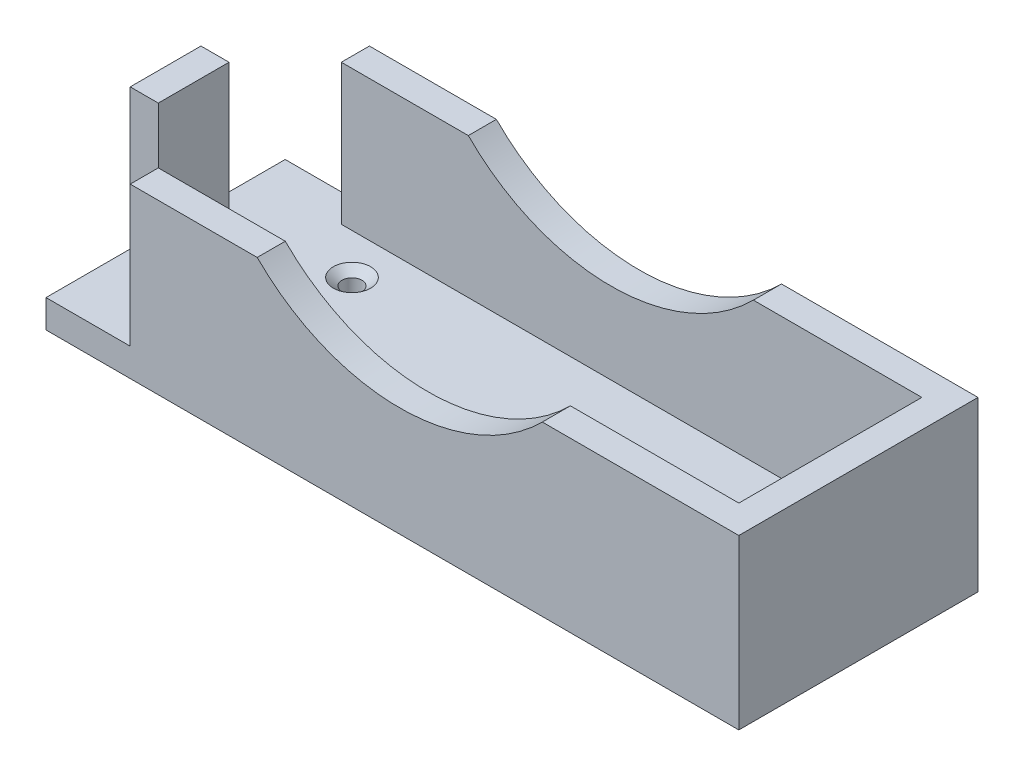
ISO-10303-21;
HEADER;
FILE_DESCRIPTION(('STEP AP214'),'2;1');
FILE_NAME('part.step','',(''),(''),'','','');
FILE_SCHEMA(('AUTOMOTIVE_DESIGN { 1 0 10303 214 1 1 1 1 }'));
ENDSEC;
DATA;
#1=APPLICATION_CONTEXT('core data for automotive mechanical design processes');
#2=APPLICATION_PROTOCOL_DEFINITION('international standard','automotive_design',2000,#1);
#3=PRODUCT_CONTEXT('',#1,'mechanical');
#4=PRODUCT('Part','Part','',(#3));
#5=PRODUCT_RELATED_PRODUCT_CATEGORY('part','',(#4));
#6=PRODUCT_DEFINITION_FORMATION('','',#4);
#7=PRODUCT_DEFINITION_CONTEXT('part definition',#1,'design');
#8=PRODUCT_DEFINITION('design','',#6,#7);
#9=PRODUCT_DEFINITION_SHAPE('','',#8);
#10=(LENGTH_UNIT() NAMED_UNIT(*) SI_UNIT(.MILLI.,.METRE.));
#11=(NAMED_UNIT(*) PLANE_ANGLE_UNIT() SI_UNIT($,.RADIAN.));
#12=(NAMED_UNIT(*) SI_UNIT($,.STERADIAN.) SOLID_ANGLE_UNIT());
#13=UNCERTAINTY_MEASURE_WITH_UNIT(LENGTH_MEASURE(1.E-05),#10,'distance_accuracy_value','');
#14=(GEOMETRIC_REPRESENTATION_CONTEXT(3) GLOBAL_UNCERTAINTY_ASSIGNED_CONTEXT((#13)) GLOBAL_UNIT_ASSIGNED_CONTEXT((#10,
#11,#12)) REPRESENTATION_CONTEXT('',''));
#15=CARTESIAN_POINT('',(0.,0.,0.));
#16=DIRECTION('',(0.,0.,1.));
#17=DIRECTION('',(1.,0.,0.));
#18=AXIS2_PLACEMENT_3D('',#15,#16,#17);
#19=CARTESIAN_POINT('',(0.,38.1,0.));
#20=DIRECTION('',(0.,1.,0.));
#21=DIRECTION('',(0.,0.,1.));
#22=AXIS2_PLACEMENT_3D('',#19,#20,#21);
#23=PLANE('',#22);
#24=DIRECTION('',(0.,0.,1.));
#25=VECTOR('',#24,1.);
#26=CARTESIAN_POINT('',(-28.0299691064171,38.1,-16.4798217821782));
#27=LINE('',#26,#25);
#28=CARTESIAN_POINT('',(-28.0299691064171,38.1,31.2721782178218));
#29=VERTEX_POINT('',#28);
#30=CARTESIAN_POINT('',(-28.0299691064171,38.1,37.6221782178218));
#31=VERTEX_POINT('',#30);
#32=EDGE_CURVE('E222',#29,#31,#27,.T.);
#33=ORIENTED_EDGE('',*,*,#32,.F.);
#34=DIRECTION('',(1.,0.,0.));
#35=VECTOR('',#34,1.);
#36=CARTESIAN_POINT('',(0.,38.1,31.2721782178218));
#37=LINE('',#36,#35);
#38=CARTESIAN_POINT('',(-56.7554506835294,38.1,31.2721782178218));
#39=VERTEX_POINT('',#38);
#40=EDGE_CURVE('E277',#39,#29,#37,.T.);
#41=ORIENTED_EDGE('',*,*,#40,.F.);
#42=DIRECTION('',(0.,0.,1.));
#43=VECTOR('',#42,1.);
#44=CARTESIAN_POINT('',(-56.7554506835295,38.1,0.));
#45=LINE('',#44,#43);
#46=CARTESIAN_POINT('',(-56.7554506835294,38.1,37.6221782178218));
#47=VERTEX_POINT('',#46);
#48=EDGE_CURVE('E280',#39,#47,#45,.T.);
#49=ORIENTED_EDGE('',*,*,#48,.T.);
#50=DIRECTION('',(1.,0.,0.));
#51=VECTOR('',#50,1.);
#52=CARTESIAN_POINT('',(0.,38.1,37.6221782178218));
#53=LINE('',#52,#51);
#54=EDGE_CURVE('E341',#47,#31,#53,.T.);
#55=ORIENTED_EDGE('',*,*,#54,.T.);
#56=EDGE_LOOP('',(#33,#41,#49,#55));
#57=FACE_BOUND('',#56,.T.);
#58=ADVANCED_FACE('F63',(#57),#23,.T.);
#59=CARTESIAN_POINT('',(-28.0299691064171,38.1,-16.4798217821782));
#60=VERTEX_POINT('',#59);
#61=CARTESIAN_POINT('',(-28.0299691064171,38.1,-10.1298217821782));
#62=VERTEX_POINT('',#61);
#63=EDGE_CURVE('E223',#60,#62,#27,.T.);
#64=ORIENTED_EDGE('',*,*,#63,.F.);
#65=DIRECTION('',(1.,0.,0.));
#66=VECTOR('',#65,1.);
#67=CARTESIAN_POINT('',(0.,38.1,-16.4798217821782));
#68=LINE('',#67,#66);
#69=CARTESIAN_POINT('',(-56.7554506835294,38.1,-16.4798217821782));
#70=VERTEX_POINT('',#69);
#71=EDGE_CURVE('E348',#70,#60,#68,.T.);
#72=ORIENTED_EDGE('',*,*,#71,.F.);
#73=DIRECTION('',(0.,0.,1.));
#74=VECTOR('',#73,1.);
#75=CARTESIAN_POINT('',(-56.7554506835294,38.1,0.));
#76=LINE('',#75,#74);
#77=CARTESIAN_POINT('',(-56.7554506835294,38.1,-10.1298217821782));
#78=VERTEX_POINT('',#77);
#79=EDGE_CURVE('E291',#70,#78,#76,.T.);
#80=ORIENTED_EDGE('',*,*,#79,.T.);
#81=DIRECTION('',(1.,0.,0.));
#82=VECTOR('',#81,1.);
#83=CARTESIAN_POINT('',(0.,38.1,-10.1298217821782));
#84=LINE('',#83,#82);
#85=EDGE_CURVE('E294',#78,#62,#84,.T.);
#86=ORIENTED_EDGE('',*,*,#85,.T.);
#87=EDGE_LOOP('',(#64,#72,#80,#86));
#88=FACE_BOUND('',#87,.T.);
#89=ADVANCED_FACE('F399',(#88),#23,.T.);
#90=CARTESIAN_POINT('',(74.5625493164706,38.1,0.));
#91=DIRECTION('',(1.,0.,0.));
#92=DIRECTION('',(0.,0.,-1.));
#93=AXIS2_PLACEMENT_3D('',#90,#91,#92);
#94=PLANE('',#93);
#95=DIRECTION('',(0.,0.,1.));
#96=VECTOR('',#95,1.);
#97=CARTESIAN_POINT('',(74.5625493164706,6.35,0.));
#98=LINE('',#97,#96);
#99=CARTESIAN_POINT('',(74.5625493164706,6.35000000000002,-10.1298217821782));
#100=VERTEX_POINT('',#99);
#101=CARTESIAN_POINT('',(74.5625493164706,6.35,31.2721782178218));
#102=VERTEX_POINT('',#101);
#103=EDGE_CURVE('E324',#100,#102,#98,.T.);
#104=ORIENTED_EDGE('',*,*,#103,.T.);
#105=DIRECTION('',(0.,-1.,0.));
#106=VECTOR('',#105,1.);
#107=CARTESIAN_POINT('',(74.5625493164706,38.1,31.2721782178218));
#108=LINE('',#107,#106);
#109=CARTESIAN_POINT('',(74.5625493164706,38.1,31.2721782178218));
#110=VERTEX_POINT('',#109);
#111=EDGE_CURVE('E283',#110,#102,#108,.T.);
#112=ORIENTED_EDGE('',*,*,#111,.F.);
#113=DIRECTION('',(0.,0.,1.));
#114=VECTOR('',#113,1.);
#115=CARTESIAN_POINT('',(74.5625493164706,38.1,0.));
#116=LINE('',#115,#114);
#117=CARTESIAN_POINT('',(74.5625493164706,38.1,-10.1298217821782));
#118=VERTEX_POINT('',#117);
#119=EDGE_CURVE('E337',#118,#110,#116,.T.);
#120=ORIENTED_EDGE('',*,*,#119,.F.);
#121=DIRECTION('',(0.,-1.,0.));
#122=VECTOR('',#121,1.);
#123=CARTESIAN_POINT('',(74.5625493164706,38.1,-10.1298217821782));
#124=LINE('',#123,#122);
#125=EDGE_CURVE('E297',#118,#100,#124,.T.);
#126=ORIENTED_EDGE('',*,*,#125,.T.);
#127=EDGE_LOOP('',(#104,#112,#120,#126));
#128=FACE_BOUND('',#127,.T.);
#129=ADVANCED_FACE('F65',(#128),#94,.F.);
#130=CARTESIAN_POINT('',(0.,38.1,37.6221782178218));
#131=DIRECTION('',(0.,0.,-1.));
#132=DIRECTION('',(-1.,0.,0.));
#133=AXIS2_PLACEMENT_3D('',#130,#131,#132);
#134=PLANE('',#133);
#135=CARTESIAN_POINT('',(36.4625493164706,38.1,37.6221782178218));
#136=VERTEX_POINT('',#135);
#137=CARTESIAN_POINT('',(80.9125493164706,38.1,37.6221782178218));
#138=VERTEX_POINT('',#137);
#139=EDGE_CURVE('E340',#136,#138,#53,.T.);
#140=ORIENTED_EDGE('',*,*,#139,.F.);
#141=CARTESIAN_POINT('',(4.21629010502675,70.3462592114439,37.6221782178218));
#142=DIRECTION('',(0.,0.,1.));
#143=DIRECTION('',(1.,0.,0.));
#144=AXIS2_PLACEMENT_3D('',#141,#142,#143);
#145=CIRCLE('',#144,45.6030971126223);
#146=EDGE_CURVE('E67',#31,#136,#145,.T.);
#147=ORIENTED_EDGE('',*,*,#146,.F.);
#148=ORIENTED_EDGE('',*,*,#54,.F.);
#149=DIRECTION('',(0.,-1.,0.));
#150=VECTOR('',#149,1.);
#151=CARTESIAN_POINT('',(-56.7554506835294,38.1,37.6221782178218));
#152=LINE('',#151,#150);
#153=CARTESIAN_POINT('',(-56.7554506835294,6.35000000000002,37.6221782178218));
#154=VERTEX_POINT('',#153);
#155=EDGE_CURVE('E285',#47,#154,#152,.T.);
#156=ORIENTED_EDGE('',*,*,#155,.T.);
#157=DIRECTION('',(1.,0.,0.));
#158=VECTOR('',#157,1.);
#159=CARTESIAN_POINT('',(0.,6.35,37.6221782178218));
#160=LINE('',#159,#158);
#161=CARTESIAN_POINT('',(-75.8054506835294,6.35,37.6221782178218));
#162=VERTEX_POINT('',#161);
#163=EDGE_CURVE('E232',#162,#154,#160,.T.);
#164=ORIENTED_EDGE('',*,*,#163,.F.);
#165=DIRECTION('',(0.,-1.,0.));
#166=VECTOR('',#165,1.);
#167=CARTESIAN_POINT('',(-75.8054506835294,6.35,37.6221782178218));
#168=LINE('',#167,#166);
#169=CARTESIAN_POINT('',(-75.8054506835294,0.,37.6221782178218));
#170=VERTEX_POINT('',#169);
#171=EDGE_CURVE('E237',#162,#170,#168,.T.);
#172=ORIENTED_EDGE('',*,*,#171,.T.);
#173=DIRECTION('',(1.,0.,0.));
#174=VECTOR('',#173,1.);
#175=CARTESIAN_POINT('',(0.,0.,37.6221782178218));
#176=LINE('',#175,#174);
#177=CARTESIAN_POINT('',(80.9125493164706,0.,37.6221782178218));
#178=VERTEX_POINT('',#177);
#179=EDGE_CURVE('E336',#170,#178,#176,.T.);
#180=ORIENTED_EDGE('',*,*,#179,.T.);
#181=DIRECTION('',(0.,-1.,0.));
#182=VECTOR('',#181,1.);
#183=CARTESIAN_POINT('',(80.9125493164706,38.1,37.6221782178218));
#184=LINE('',#183,#182);
#185=EDGE_CURVE('E72',#138,#178,#184,.T.);
#186=ORIENTED_EDGE('',*,*,#185,.F.);
#187=EDGE_LOOP('',(#140,#147,#148,#156,#164,#172,#180,#186));
#188=FACE_BOUND('',#187,.T.);
#189=ADVANCED_FACE('F368',(#188),#134,.F.);
#190=CARTESIAN_POINT('',(80.9125493164706,38.1,0.));
#191=DIRECTION('',(1.,0.,0.));
#192=DIRECTION('',(0.,0.,-1.));
#193=AXIS2_PLACEMENT_3D('',#190,#191,#192);
#194=PLANE('',#193);
#195=DIRECTION('',(0.,0.,1.));
#196=VECTOR('',#195,1.);
#197=CARTESIAN_POINT('',(80.9125493164706,0.,0.));
#198=LINE('',#197,#196);
#199=CARTESIAN_POINT('',(80.9125493164706,0.,-16.4798217821782));
#200=VERTEX_POINT('',#199);
#201=EDGE_CURVE('E354',#200,#178,#198,.T.);
#202=ORIENTED_EDGE('',*,*,#201,.F.);
#203=DIRECTION('',(0.,-1.,0.));
#204=VECTOR('',#203,1.);
#205=CARTESIAN_POINT('',(80.9125493164706,38.1,-16.4798217821782));
#206=LINE('',#205,#204);
#207=CARTESIAN_POINT('',(80.9125493164706,38.1,-16.4798217821782));
#208=VERTEX_POINT('',#207);
#209=EDGE_CURVE('E351',#208,#200,#206,.T.);
#210=ORIENTED_EDGE('',*,*,#209,.F.);
#211=DIRECTION('',(0.,0.,1.));
#212=VECTOR('',#211,1.);
#213=CARTESIAN_POINT('',(80.9125493164706,38.1,0.));
#214=LINE('',#213,#212);
#215=EDGE_CURVE('E344',#208,#138,#214,.T.);
#216=ORIENTED_EDGE('',*,*,#215,.T.);
#217=ORIENTED_EDGE('',*,*,#185,.T.);
#218=EDGE_LOOP('',(#202,#210,#216,#217));
#219=FACE_BOUND('',#218,.T.);
#220=ADVANCED_FACE('F362',(#219),#194,.T.);
#221=CARTESIAN_POINT('',(0.,38.1,-16.4798217821782));
#222=DIRECTION('',(0.,0.,-1.));
#223=DIRECTION('',(-1.,0.,0.));
#224=AXIS2_PLACEMENT_3D('',#221,#222,#223);
#225=PLANE('',#224);
#226=CARTESIAN_POINT('',(4.21629010502675,70.3462592114439,-16.4798217821782));
#227=DIRECTION('',(0.,0.,1.));
#228=DIRECTION('',(-1.,0.,0.));
#229=AXIS2_PLACEMENT_3D('',#226,#227,#228);
#230=CIRCLE('',#229,45.6030971126223);
#231=CARTESIAN_POINT('',(36.4625493164706,38.1,-16.4798217821782));
#232=VERTEX_POINT('',#231);
#233=EDGE_CURVE('E200',#60,#232,#230,.T.);
#234=ORIENTED_EDGE('',*,*,#233,.T.);
#235=EDGE_CURVE('E347',#232,#208,#68,.T.);
#236=ORIENTED_EDGE('',*,*,#235,.T.);
#237=ORIENTED_EDGE('',*,*,#209,.T.);
#238=DIRECTION('',(1.,0.,0.));
#239=VECTOR('',#238,1.);
#240=CARTESIAN_POINT('',(0.,0.,-16.4798217821782));
#241=LINE('',#240,#239);
#242=CARTESIAN_POINT('',(-75.8054506835294,0.,-16.4798217821782));
#243=VERTEX_POINT('',#242);
#244=EDGE_CURVE('E198',#243,#200,#241,.T.);
#245=ORIENTED_EDGE('',*,*,#244,.F.);
#246=DIRECTION('',(0.,-1.,0.));
#247=VECTOR('',#246,1.);
#248=CARTESIAN_POINT('',(-75.8054506835294,6.35,-16.4798217821782));
#249=LINE('',#248,#247);
#250=CARTESIAN_POINT('',(-75.8054506835294,6.35,-16.4798217821782));
#251=VERTEX_POINT('',#250);
#252=EDGE_CURVE('E191',#251,#243,#249,.T.);
#253=ORIENTED_EDGE('',*,*,#252,.F.);
#254=DIRECTION('',(1.,0.,0.));
#255=VECTOR('',#254,1.);
#256=CARTESIAN_POINT('',(0.,6.35,-16.4798217821782));
#257=LINE('',#256,#255);
#258=CARTESIAN_POINT('',(-56.7554506835294,6.35000000000002,-16.4798217821782));
#259=VERTEX_POINT('',#258);
#260=EDGE_CURVE('E196',#251,#259,#257,.T.);
#261=ORIENTED_EDGE('',*,*,#260,.T.);
#262=DIRECTION('',(0.,-1.,0.));
#263=VECTOR('',#262,1.);
#264=CARTESIAN_POINT('',(-56.7554506835294,38.1,-16.4798217821782));
#265=LINE('',#264,#263);
#266=EDGE_CURVE('E87',#70,#259,#265,.T.);
#267=ORIENTED_EDGE('',*,*,#266,.F.);
#268=ORIENTED_EDGE('',*,*,#71,.T.);
#269=EDGE_LOOP('',(#234,#236,#237,#245,#253,#261,#267,#268));
#270=FACE_BOUND('',#269,.T.);
#271=ADVANCED_FACE('F194',(#270),#225,.T.);
#272=DIRECTION('',(0.,0.,1.));
#273=VECTOR('',#272,1.);
#274=CARTESIAN_POINT('',(36.4625493164706,38.1,-16.4798217821782));
#275=LINE('',#274,#273);
#276=CARTESIAN_POINT('',(36.4625493164706,38.1,31.2721782178218));
#277=VERTEX_POINT('',#276);
#278=EDGE_CURVE('E218',#277,#136,#275,.T.);
#279=ORIENTED_EDGE('',*,*,#278,.T.);
#280=ORIENTED_EDGE('',*,*,#139,.T.);
#281=ORIENTED_EDGE('',*,*,#215,.F.);
#282=ORIENTED_EDGE('',*,*,#235,.F.);
#283=CARTESIAN_POINT('',(36.4625493164706,38.1,-10.1298217821782));
#284=VERTEX_POINT('',#283);
#285=EDGE_CURVE('E219',#232,#284,#275,.T.);
#286=ORIENTED_EDGE('',*,*,#285,.T.);
#287=EDGE_CURVE('E293',#284,#118,#84,.T.);
#288=ORIENTED_EDGE('',*,*,#287,.T.);
#289=ORIENTED_EDGE('',*,*,#119,.T.);
#290=EDGE_CURVE('E276',#277,#110,#37,.T.);
#291=ORIENTED_EDGE('',*,*,#290,.F.);
#292=EDGE_LOOP('',(#279,#280,#281,#282,#286,#288,#289,#291));
#293=FACE_BOUND('',#292,.T.);
#294=ADVANCED_FACE('F402',(#293),#23,.T.);
#295=CARTESIAN_POINT('',(0.,0.,0.));
#296=DIRECTION('',(0.,1.,0.));
#297=DIRECTION('',(0.,0.,1.));
#298=AXIS2_PLACEMENT_3D('',#295,#296,#297);
#299=PLANE('',#298);
#300=CARTESIAN_POINT('',(-45.1349506835294,0.,21.9376782178218));
#301=DIRECTION('',(0.,1.,0.));
#302=DIRECTION('',(0.,0.,1.));
#303=AXIS2_PLACEMENT_3D('',#300,#301,#302);
#304=CIRCLE('',#303,2.2479);
#305=CARTESIAN_POINT('',(-45.1349506835294,0.,24.1855782178218));
#306=VERTEX_POINT('',#305);
#307=EDGE_CURVE('E246',#306,#306,#304,.T.);
#308=ORIENTED_EDGE('',*,*,#307,.T.);
#309=EDGE_LOOP('',(#308));
#310=FACE_BOUND('',#309,.T.);
#311=CARTESIAN_POINT('',(-45.1349506835295,0.,-0.922321782178217));
#312=DIRECTION('',(0.,1.,0.));
#313=DIRECTION('',(0.,0.,1.));
#314=AXIS2_PLACEMENT_3D('',#311,#312,#313);
#315=CIRCLE('',#314,2.2479);
#316=CARTESIAN_POINT('',(-45.1349506835295,0.,1.32557821782178));
#317=VERTEX_POINT('',#316);
#318=EDGE_CURVE('E255',#317,#317,#315,.T.);
#319=ORIENTED_EDGE('',*,*,#318,.T.);
#320=EDGE_LOOP('',(#319));
#321=FACE_BOUND('',#320,.T.);
#322=CARTESIAN_POINT('',(50.1150493164705,0.,-0.858821782178217));
#323=DIRECTION('',(0.,1.,0.));
#324=DIRECTION('',(0.,0.,1.));
#325=AXIS2_PLACEMENT_3D('',#322,#323,#324);
#326=CIRCLE('',#325,2.2479);
#327=CARTESIAN_POINT('',(50.1150493164705,0.,1.38907821782178));
#328=VERTEX_POINT('',#327);
#329=EDGE_CURVE('E264',#328,#328,#326,.T.);
#330=ORIENTED_EDGE('',*,*,#329,.T.);
#331=EDGE_LOOP('',(#330));
#332=FACE_BOUND('',#331,.T.);
#333=CARTESIAN_POINT('',(50.1150493164706,0.,22.0011782178218));
#334=DIRECTION('',(0.,1.,0.));
#335=DIRECTION('',(0.,0.,1.));
#336=AXIS2_PLACEMENT_3D('',#333,#334,#335);
#337=CIRCLE('',#336,2.2479);
#338=CARTESIAN_POINT('',(50.1150493164706,0.,24.2490782178218));
#339=VERTEX_POINT('',#338);
#340=EDGE_CURVE('E273',#339,#339,#337,.T.);
#341=ORIENTED_EDGE('',*,*,#340,.T.);
#342=EDGE_LOOP('',(#341));
#343=FACE_BOUND('',#342,.T.);
#344=ORIENTED_EDGE('',*,*,#179,.F.);
#345=DIRECTION('',(0.,0.,1.));
#346=VECTOR('',#345,1.);
#347=CARTESIAN_POINT('',(-75.8054506835294,0.,0.));
#348=LINE('',#347,#346);
#349=EDGE_CURVE('E304',#243,#170,#348,.T.);
#350=ORIENTED_EDGE('',*,*,#349,.F.);
#351=ORIENTED_EDGE('',*,*,#244,.T.);
#352=ORIENTED_EDGE('',*,*,#201,.T.);
#353=EDGE_LOOP('',(#344,#350,#351,#352));
#354=FACE_BOUND('',#353,.T.);
#355=ADVANCED_FACE('F372',(#310,#321,#332,#343,#354),#299,.F.);
#356=CARTESIAN_POINT('',(0.,6.35,0.));
#357=DIRECTION('',(0.,1.,0.));
#358=DIRECTION('',(0.,0.,1.));
#359=AXIS2_PLACEMENT_3D('',#356,#357,#358);
#360=PLANE('',#359);
#361=DIRECTION('',(1.,0.,0.));
#362=VECTOR('',#361,1.);
#363=CARTESIAN_POINT('',(0.,6.35,2.57017821782178));
#364=LINE('',#363,#362);
#365=CARTESIAN_POINT('',(-75.8054506835294,6.35000000000002,2.57017821782178));
#366=VERTEX_POINT('',#365);
#367=CARTESIAN_POINT('',(-69.4554506835294,6.35000000000003,2.57017821782178));
#368=VERTEX_POINT('',#367);
#369=EDGE_CURVE('E79',#366,#368,#364,.T.);
#370=ORIENTED_EDGE('',*,*,#369,.T.);
#371=DIRECTION('',(0.,0.,1.));
#372=VECTOR('',#371,1.);
#373=CARTESIAN_POINT('',(-69.4554506835294,6.35,0.));
#374=LINE('',#373,#372);
#375=CARTESIAN_POINT('',(-69.4554506835294,6.35000000000003,18.5721782178218));
#376=VERTEX_POINT('',#375);
#377=EDGE_CURVE('E330',#368,#376,#374,.T.);
#378=ORIENTED_EDGE('',*,*,#377,.T.);
#379=DIRECTION('',(1.,0.,0.));
#380=VECTOR('',#379,1.);
#381=CARTESIAN_POINT('',(0.,6.35,18.5721782178218));
#382=LINE('',#381,#380);
#383=CARTESIAN_POINT('',(-75.8054506835294,6.35000000000002,18.5721782178218));
#384=VERTEX_POINT('',#383);
#385=EDGE_CURVE('E228',#384,#376,#382,.T.);
#386=ORIENTED_EDGE('',*,*,#385,.F.);
#387=DIRECTION('',(0.,0.,1.));
#388=VECTOR('',#387,1.);
#389=CARTESIAN_POINT('',(-75.8054506835294,6.35,0.));
#390=LINE('',#389,#388);
#391=EDGE_CURVE('E230',#384,#162,#390,.T.);
#392=ORIENTED_EDGE('',*,*,#391,.T.);
#393=ORIENTED_EDGE('',*,*,#163,.T.);
#394=DIRECTION('',(0.,0.,1.));
#395=VECTOR('',#394,1.);
#396=CARTESIAN_POINT('',(-56.7554506835295,6.35,0.));
#397=LINE('',#396,#395);
#398=CARTESIAN_POINT('',(-56.7554506835294,6.35000000000002,31.2721782178218));
#399=VERTEX_POINT('',#398);
#400=EDGE_CURVE('E235',#399,#154,#397,.T.);
#401=ORIENTED_EDGE('',*,*,#400,.F.);
#402=DIRECTION('',(1.,0.,0.));
#403=VECTOR('',#402,1.);
#404=CARTESIAN_POINT('',(0.,6.35,31.2721782178218));
#405=LINE('',#404,#403);
#406=EDGE_CURVE('E333',#399,#102,#405,.T.);
#407=ORIENTED_EDGE('',*,*,#406,.T.);
#408=ORIENTED_EDGE('',*,*,#103,.F.);
#409=DIRECTION('',(1.,0.,0.));
#410=VECTOR('',#409,1.);
#411=CARTESIAN_POINT('',(0.,6.35,-10.1298217821782));
#412=LINE('',#411,#410);
#413=CARTESIAN_POINT('',(-56.7554506835294,6.35,-10.1298217821782));
#414=VERTEX_POINT('',#413);
#415=EDGE_CURVE('E327',#414,#100,#412,.T.);
#416=ORIENTED_EDGE('',*,*,#415,.F.);
#417=DIRECTION('',(0.,0.,1.));
#418=VECTOR('',#417,1.);
#419=CARTESIAN_POINT('',(-56.7554506835294,6.35,0.));
#420=LINE('',#419,#418);
#421=EDGE_CURVE('E212',#259,#414,#420,.T.);
#422=ORIENTED_EDGE('',*,*,#421,.F.);
#423=ORIENTED_EDGE('',*,*,#260,.F.);
#424=DIRECTION('',(0.,0.,1.));
#425=VECTOR('',#424,1.);
#426=CARTESIAN_POINT('',(-75.8054506835294,6.35,0.));
#427=LINE('',#426,#425);
#428=EDGE_CURVE('E203',#251,#366,#427,.T.);
#429=ORIENTED_EDGE('',*,*,#428,.T.);
#430=EDGE_LOOP('',(#370,#378,#386,#392,#393,#401,#407,#408,#416,#422,#423,#429));
#431=FACE_BOUND('',#430,.T.);
#432=CARTESIAN_POINT('',(-45.1349506835294,6.35,21.9376782178218));
#433=DIRECTION('',(0.,1.,0.));
#434=DIRECTION('',(0.,0.,1.));
#435=AXIS2_PLACEMENT_3D('',#432,#433,#434);
#436=CIRCLE('',#435,4.2164);
#437=CARTESIAN_POINT('',(-45.1349506835294,6.35,26.1540782178218));
#438=VERTEX_POINT('',#437);
#439=EDGE_CURVE('E240',#438,#438,#436,.T.);
#440=ORIENTED_EDGE('',*,*,#439,.F.);
#441=EDGE_LOOP('',(#440));
#442=FACE_BOUND('',#441,.T.);
#443=CARTESIAN_POINT('',(-45.1349506835295,6.35,-0.922321782178217));
#444=DIRECTION('',(0.,1.,0.));
#445=DIRECTION('',(0.,0.,1.));
#446=AXIS2_PLACEMENT_3D('',#443,#444,#445);
#447=CIRCLE('',#446,4.2164);
#448=CARTESIAN_POINT('',(-45.1349506835295,6.35,3.29407821782179));
#449=VERTEX_POINT('',#448);
#450=EDGE_CURVE('E249',#449,#449,#447,.T.);
#451=ORIENTED_EDGE('',*,*,#450,.F.);
#452=EDGE_LOOP('',(#451));
#453=FACE_BOUND('',#452,.T.);
#454=CARTESIAN_POINT('',(50.1150493164705,6.35,-0.858821782178217));
#455=DIRECTION('',(0.,1.,0.));
#456=DIRECTION('',(0.,0.,1.));
#457=AXIS2_PLACEMENT_3D('',#454,#455,#456);
#458=CIRCLE('',#457,4.2164);
#459=CARTESIAN_POINT('',(50.1150493164705,6.35,3.35757821782178));
#460=VERTEX_POINT('',#459);
#461=EDGE_CURVE('E258',#460,#460,#458,.T.);
#462=ORIENTED_EDGE('',*,*,#461,.F.);
#463=EDGE_LOOP('',(#462));
#464=FACE_BOUND('',#463,.T.);
#465=CARTESIAN_POINT('',(50.1150493164706,6.35,22.0011782178218));
#466=DIRECTION('',(0.,1.,0.));
#467=DIRECTION('',(0.,0.,1.));
#468=AXIS2_PLACEMENT_3D('',#465,#466,#467);
#469=CIRCLE('',#468,4.2164);
#470=CARTESIAN_POINT('',(50.1150493164706,6.35,26.2175782178218));
#471=VERTEX_POINT('',#470);
#472=EDGE_CURVE('E267',#471,#471,#469,.T.);
#473=ORIENTED_EDGE('',*,*,#472,.F.);
#474=EDGE_LOOP('',(#473));
#475=FACE_BOUND('',#474,.T.);
#476=ADVANCED_FACE('F209',(#431,#442,#453,#464,#475),#360,.T.);
#477=CARTESIAN_POINT('',(-69.4554506835294,38.1,0.));
#478=DIRECTION('',(1.,0.,0.));
#479=DIRECTION('',(0.,0.,-1.));
#480=AXIS2_PLACEMENT_3D('',#477,#478,#479);
#481=PLANE('',#480);
#482=ORIENTED_EDGE('',*,*,#377,.F.);
#483=DIRECTION('',(0.,-1.,0.));
#484=VECTOR('',#483,1.);
#485=CARTESIAN_POINT('',(-69.4554506835294,38.1,2.57017821782178));
#486=LINE('',#485,#484);
#487=CARTESIAN_POINT('',(-69.4554506835294,38.1,2.57017821782178));
#488=VERTEX_POINT('',#487);
#489=EDGE_CURVE('E315',#488,#368,#486,.T.);
#490=ORIENTED_EDGE('',*,*,#489,.F.);
#491=DIRECTION('',(0.,0.,1.));
#492=VECTOR('',#491,1.);
#493=CARTESIAN_POINT('',(-69.4554506835294,38.1,0.));
#494=LINE('',#493,#492);
#495=CARTESIAN_POINT('',(-69.4554506835294,38.1,18.5721782178218));
#496=VERTEX_POINT('',#495);
#497=EDGE_CURVE('E312',#488,#496,#494,.T.);
#498=ORIENTED_EDGE('',*,*,#497,.T.);
#499=DIRECTION('',(0.,-1.,0.));
#500=VECTOR('',#499,1.);
#501=CARTESIAN_POINT('',(-69.4554506835294,38.1,18.5721782178218));
#502=LINE('',#501,#500);
#503=EDGE_CURVE('E318',#496,#376,#502,.T.);
#504=ORIENTED_EDGE('',*,*,#503,.T.);
#505=EDGE_LOOP('',(#482,#490,#498,#504));
#506=FACE_BOUND('',#505,.T.);
#507=ADVANCED_FACE('F383',(#506),#481,.T.);
#508=CARTESIAN_POINT('',(0.,38.1,2.57017821782178));
#509=DIRECTION('',(0.,0.,-1.));
#510=DIRECTION('',(-1.,0.,0.));
#511=AXIS2_PLACEMENT_3D('',#508,#509,#510);
#512=PLANE('',#511);
#513=ORIENTED_EDGE('',*,*,#369,.F.);
#514=DIRECTION('',(0.,-1.,0.));
#515=VECTOR('',#514,1.);
#516=CARTESIAN_POINT('',(-75.8054506835294,38.1,2.57017821782178));
#517=LINE('',#516,#515);
#518=CARTESIAN_POINT('',(-75.8054506835294,38.1,2.57017821782178));
#519=VERTEX_POINT('',#518);
#520=EDGE_CURVE('E206',#519,#366,#517,.T.);
#521=ORIENTED_EDGE('',*,*,#520,.F.);
#522=DIRECTION('',(1.,0.,0.));
#523=VECTOR('',#522,1.);
#524=CARTESIAN_POINT('',(0.,38.1,2.57017821782178));
#525=LINE('',#524,#523);
#526=EDGE_CURVE('E305',#519,#488,#525,.T.);
#527=ORIENTED_EDGE('',*,*,#526,.T.);
#528=ORIENTED_EDGE('',*,*,#489,.T.);
#529=EDGE_LOOP('',(#513,#521,#527,#528));
#530=FACE_BOUND('',#529,.T.);
#531=ADVANCED_FACE('F388',(#530),#512,.T.);
#532=CARTESIAN_POINT('',(-75.8054506835294,38.1,0.));
#533=DIRECTION('',(1.,0.,0.));
#534=DIRECTION('',(0.,0.,-1.));
#535=AXIS2_PLACEMENT_3D('',#532,#533,#534);
#536=PLANE('',#535);
#537=ORIENTED_EDGE('',*,*,#349,.T.);
#538=ORIENTED_EDGE('',*,*,#171,.F.);
#539=ORIENTED_EDGE('',*,*,#391,.F.);
#540=DIRECTION('',(0.,-1.,0.));
#541=VECTOR('',#540,1.);
#542=CARTESIAN_POINT('',(-75.8054506835294,38.1,18.5721782178218));
#543=LINE('',#542,#541);
#544=CARTESIAN_POINT('',(-75.8054506835294,38.1,18.5721782178218));
#545=VERTEX_POINT('',#544);
#546=EDGE_CURVE('E321',#545,#384,#543,.T.);
#547=ORIENTED_EDGE('',*,*,#546,.F.);
#548=DIRECTION('',(0.,0.,1.));
#549=VECTOR('',#548,1.);
#550=CARTESIAN_POINT('',(-75.8054506835294,38.1,0.));
#551=LINE('',#550,#549);
#552=EDGE_CURVE('E308',#519,#545,#551,.T.);
#553=ORIENTED_EDGE('',*,*,#552,.F.);
#554=ORIENTED_EDGE('',*,*,#520,.T.);
#555=ORIENTED_EDGE('',*,*,#428,.F.);
#556=ORIENTED_EDGE('',*,*,#252,.T.);
#557=EDGE_LOOP('',(#537,#538,#539,#547,#553,#554,#555,#556));
#558=FACE_BOUND('',#557,.T.);
#559=ADVANCED_FACE('F204',(#558),#536,.F.);
#560=CARTESIAN_POINT('',(0.,38.1,18.5721782178218));
#561=DIRECTION('',(0.,0.,-1.));
#562=DIRECTION('',(-1.,0.,0.));
#563=AXIS2_PLACEMENT_3D('',#560,#561,#562);
#564=PLANE('',#563);
#565=ORIENTED_EDGE('',*,*,#546,.T.);
#566=ORIENTED_EDGE('',*,*,#385,.T.);
#567=ORIENTED_EDGE('',*,*,#503,.F.);
#568=DIRECTION('',(1.,0.,0.));
#569=VECTOR('',#568,1.);
#570=CARTESIAN_POINT('',(0.,38.1,18.5721782178218));
#571=LINE('',#570,#569);
#572=EDGE_CURVE('E310',#545,#496,#571,.T.);
#573=ORIENTED_EDGE('',*,*,#572,.F.);
#574=EDGE_LOOP('',(#565,#566,#567,#573));
#575=FACE_BOUND('',#574,.T.);
#576=ADVANCED_FACE('F380',(#575),#564,.F.);
#577=CARTESIAN_POINT('',(0.,38.1,0.));
#578=DIRECTION('',(0.,1.,0.));
#579=DIRECTION('',(0.,0.,1.));
#580=AXIS2_PLACEMENT_3D('',#577,#578,#579);
#581=PLANE('',#580);
#582=ORIENTED_EDGE('',*,*,#526,.F.);
#583=ORIENTED_EDGE('',*,*,#552,.T.);
#584=ORIENTED_EDGE('',*,*,#572,.T.);
#585=ORIENTED_EDGE('',*,*,#497,.F.);
#586=EDGE_LOOP('',(#582,#583,#584,#585));
#587=FACE_BOUND('',#586,.T.);
#588=ADVANCED_FACE('F387',(#587),#581,.T.);
#589=CARTESIAN_POINT('',(-56.7554506835294,38.1,0.));
#590=DIRECTION('',(1.,0.,0.));
#591=DIRECTION('',(0.,0.,-1.));
#592=AXIS2_PLACEMENT_3D('',#589,#590,#591);
#593=PLANE('',#592);
#594=ORIENTED_EDGE('',*,*,#266,.T.);
#595=ORIENTED_EDGE('',*,*,#421,.T.);
#596=DIRECTION('',(0.,-1.,0.));
#597=VECTOR('',#596,1.);
#598=CARTESIAN_POINT('',(-56.7554506835294,38.1,-10.1298217821782));
#599=LINE('',#598,#597);
#600=EDGE_CURVE('E300',#78,#414,#599,.T.);
#601=ORIENTED_EDGE('',*,*,#600,.F.);
#602=ORIENTED_EDGE('',*,*,#79,.F.);
#603=EDGE_LOOP('',(#594,#595,#601,#602));
#604=FACE_BOUND('',#603,.T.);
#605=ADVANCED_FACE('F437',(#604),#593,.F.);
#606=CARTESIAN_POINT('',(0.,38.1,-10.1298217821782));
#607=DIRECTION('',(0.,0.,-1.));
#608=DIRECTION('',(-1.,0.,0.));
#609=AXIS2_PLACEMENT_3D('',#606,#607,#608);
#610=PLANE('',#609);
#611=ORIENTED_EDGE('',*,*,#287,.F.);
#612=CARTESIAN_POINT('',(4.21629010502675,70.3462592114439,-10.1298217821782));
#613=DIRECTION('',(0.,0.,-1.));
#614=DIRECTION('',(-1.,0.,0.));
#615=AXIS2_PLACEMENT_3D('',#612,#613,#614);
#616=CIRCLE('',#615,45.6030971126223);
#617=EDGE_CURVE('E225',#284,#62,#616,.T.);
#618=ORIENTED_EDGE('',*,*,#617,.T.);
#619=ORIENTED_EDGE('',*,*,#85,.F.);
#620=ORIENTED_EDGE('',*,*,#600,.T.);
#621=ORIENTED_EDGE('',*,*,#415,.T.);
#622=ORIENTED_EDGE('',*,*,#125,.F.);
#623=EDGE_LOOP('',(#611,#618,#619,#620,#621,#622));
#624=FACE_BOUND('',#623,.T.);
#625=ADVANCED_FACE('F434',(#624),#610,.F.);
#626=CARTESIAN_POINT('',(0.,38.1,31.2721782178218));
#627=DIRECTION('',(0.,0.,-1.));
#628=DIRECTION('',(-1.,0.,0.));
#629=AXIS2_PLACEMENT_3D('',#626,#627,#628);
#630=PLANE('',#629);
#631=CARTESIAN_POINT('',(4.21629010502675,70.3462592114439,31.2721782178218));
#632=DIRECTION('',(0.,0.,-1.));
#633=DIRECTION('',(-1.,0.,0.));
#634=AXIS2_PLACEMENT_3D('',#631,#632,#633);
#635=CIRCLE('',#634,45.6030971126223);
#636=EDGE_CURVE('E12',#277,#29,#635,.T.);
#637=ORIENTED_EDGE('',*,*,#636,.F.);
#638=ORIENTED_EDGE('',*,*,#290,.T.);
#639=ORIENTED_EDGE('',*,*,#111,.T.);
#640=ORIENTED_EDGE('',*,*,#406,.F.);
#641=DIRECTION('',(0.,-1.,0.));
#642=VECTOR('',#641,1.);
#643=CARTESIAN_POINT('',(-56.7554506835294,38.1,31.2721782178218));
#644=LINE('',#643,#642);
#645=EDGE_CURVE('E288',#39,#399,#644,.T.);
#646=ORIENTED_EDGE('',*,*,#645,.F.);
#647=ORIENTED_EDGE('',*,*,#40,.T.);
#648=EDGE_LOOP('',(#637,#638,#639,#640,#646,#647));
#649=FACE_BOUND('',#648,.T.);
#650=ADVANCED_FACE('F427',(#649),#630,.T.);
#651=CARTESIAN_POINT('',(-56.7554506835295,38.1,0.));
#652=DIRECTION('',(1.,0.,0.));
#653=DIRECTION('',(0.,0.,-1.));
#654=AXIS2_PLACEMENT_3D('',#651,#652,#653);
#655=PLANE('',#654);
#656=ORIENTED_EDGE('',*,*,#645,.T.);
#657=ORIENTED_EDGE('',*,*,#400,.T.);
#658=ORIENTED_EDGE('',*,*,#155,.F.);
#659=ORIENTED_EDGE('',*,*,#48,.F.);
#660=EDGE_LOOP('',(#656,#657,#658,#659));
#661=FACE_BOUND('',#660,.T.);
#662=ADVANCED_FACE('F425',(#661),#655,.F.);
#663=CARTESIAN_POINT('',(50.1150493164706,6.35,22.0011782178218));
#664=DIRECTION('',(0.,1.,0.));
#665=DIRECTION('',(0.,0.,1.));
#666=AXIS2_PLACEMENT_3D('',#663,#664,#665);
#667=CYLINDRICAL_SURFACE('',#666,2.24789999999999);
#668=ORIENTED_EDGE('',*,*,#340,.F.);
#669=EDGE_LOOP('',(#668));
#670=FACE_BOUND('',#669,.T.);
#671=CARTESIAN_POINT('',(50.1150493164706,4.69823237602753,22.0011782178218));
#672=DIRECTION('',(0.,1.,0.));
#673=DIRECTION('',(0.,0.,1.));
#674=AXIS2_PLACEMENT_3D('',#671,#672,#673);
#675=CIRCLE('',#674,2.24789999999998);
#676=CARTESIAN_POINT('',(50.1150493164706,4.69823237602753,24.2490782178218));
#677=VERTEX_POINT('',#676);
#678=EDGE_CURVE('E270',#677,#677,#675,.T.);
#679=ORIENTED_EDGE('',*,*,#678,.T.);
#680=EDGE_LOOP('',(#679));
#681=FACE_BOUND('',#680,.T.);
#682=ADVANCED_FACE('F476',(#670,#681),#667,.F.);
#683=CARTESIAN_POINT('',(50.1150493164706,6.35,22.0011782178218));
#684=DIRECTION('',(0.,1.,0.));
#685=DIRECTION('',(0.,0.,1.));
#686=AXIS2_PLACEMENT_3D('',#683,#684,#685);
#687=CONICAL_SURFACE('',#686,4.2164,0.872664625997171);
#688=ORIENTED_EDGE('',*,*,#678,.F.);
#689=EDGE_LOOP('',(#688));
#690=FACE_BOUND('',#689,.T.);
#691=ORIENTED_EDGE('',*,*,#472,.T.);
#692=EDGE_LOOP('',(#691));
#693=FACE_BOUND('',#692,.T.);
#694=ADVANCED_FACE('F472',(#690,#693),#687,.F.);
#695=CARTESIAN_POINT('',(50.1150493164705,6.35,-0.858821782178217));
#696=DIRECTION('',(0.,1.,0.));
#697=DIRECTION('',(0.,0.,1.));
#698=AXIS2_PLACEMENT_3D('',#695,#696,#697);
#699=CYLINDRICAL_SURFACE('',#698,2.24789999999999);
#700=ORIENTED_EDGE('',*,*,#329,.F.);
#701=EDGE_LOOP('',(#700));
#702=FACE_BOUND('',#701,.T.);
#703=CARTESIAN_POINT('',(50.1150493164705,4.69823237602753,-0.858821782178217));
#704=DIRECTION('',(0.,1.,0.));
#705=DIRECTION('',(0.,0.,1.));
#706=AXIS2_PLACEMENT_3D('',#703,#704,#705);
#707=CIRCLE('',#706,2.24789999999998);
#708=CARTESIAN_POINT('',(50.1150493164705,4.69823237602753,1.38907821782177));
#709=VERTEX_POINT('',#708);
#710=EDGE_CURVE('E261',#709,#709,#707,.T.);
#711=ORIENTED_EDGE('',*,*,#710,.T.);
#712=EDGE_LOOP('',(#711));
#713=FACE_BOUND('',#712,.T.);
#714=ADVANCED_FACE('F468',(#702,#713),#699,.F.);
#715=CARTESIAN_POINT('',(50.1150493164705,6.35,-0.858821782178217));
#716=DIRECTION('',(0.,1.,0.));
#717=DIRECTION('',(0.,0.,1.));
#718=AXIS2_PLACEMENT_3D('',#715,#716,#717);
#719=CONICAL_SURFACE('',#718,4.2164,0.872664625997171);
#720=ORIENTED_EDGE('',*,*,#710,.F.);
#721=EDGE_LOOP('',(#720));
#722=FACE_BOUND('',#721,.T.);
#723=ORIENTED_EDGE('',*,*,#461,.T.);
#724=EDGE_LOOP('',(#723));
#725=FACE_BOUND('',#724,.T.);
#726=ADVANCED_FACE('F464',(#722,#725),#719,.F.);
#727=CARTESIAN_POINT('',(-45.1349506835295,6.35,-0.922321782178217));
#728=DIRECTION('',(0.,1.,0.));
#729=DIRECTION('',(0.,0.,1.));
#730=AXIS2_PLACEMENT_3D('',#727,#728,#729);
#731=CYLINDRICAL_SURFACE('',#730,2.24789999999999);
#732=ORIENTED_EDGE('',*,*,#318,.F.);
#733=EDGE_LOOP('',(#732));
#734=FACE_BOUND('',#733,.T.);
#735=CARTESIAN_POINT('',(-45.1349506835295,4.69823237602753,-0.922321782178217));
#736=DIRECTION('',(0.,1.,0.));
#737=DIRECTION('',(0.,0.,1.));
#738=AXIS2_PLACEMENT_3D('',#735,#736,#737);
#739=CIRCLE('',#738,2.24789999999998);
#740=CARTESIAN_POINT('',(-45.1349506835295,4.69823237602753,1.32557821782177));
#741=VERTEX_POINT('',#740);
#742=EDGE_CURVE('E252',#741,#741,#739,.T.);
#743=ORIENTED_EDGE('',*,*,#742,.T.);
#744=EDGE_LOOP('',(#743));
#745=FACE_BOUND('',#744,.T.);
#746=ADVANCED_FACE('F460',(#734,#745),#731,.F.);
#747=CARTESIAN_POINT('',(-45.1349506835295,6.35,-0.922321782178217));
#748=DIRECTION('',(0.,1.,0.));
#749=DIRECTION('',(0.,0.,1.));
#750=AXIS2_PLACEMENT_3D('',#747,#748,#749);
#751=CONICAL_SURFACE('',#750,4.2164,0.872664625997171);
#752=ORIENTED_EDGE('',*,*,#742,.F.);
#753=EDGE_LOOP('',(#752));
#754=FACE_BOUND('',#753,.T.);
#755=ORIENTED_EDGE('',*,*,#450,.T.);
#756=EDGE_LOOP('',(#755));
#757=FACE_BOUND('',#756,.T.);
#758=ADVANCED_FACE('F456',(#754,#757),#751,.F.);
#759=CARTESIAN_POINT('',(-45.1349506835294,6.35,21.9376782178218));
#760=DIRECTION('',(0.,1.,0.));
#761=DIRECTION('',(0.,0.,1.));
#762=AXIS2_PLACEMENT_3D('',#759,#760,#761);
#763=CYLINDRICAL_SURFACE('',#762,2.24789999999999);
#764=ORIENTED_EDGE('',*,*,#307,.F.);
#765=EDGE_LOOP('',(#764));
#766=FACE_BOUND('',#765,.T.);
#767=CARTESIAN_POINT('',(-45.1349506835294,4.69823237602753,21.9376782178218));
#768=DIRECTION('',(0.,1.,0.));
#769=DIRECTION('',(0.,0.,1.));
#770=AXIS2_PLACEMENT_3D('',#767,#768,#769);
#771=CIRCLE('',#770,2.24789999999999);
#772=CARTESIAN_POINT('',(-45.1349506835294,4.69823237602753,24.1855782178218));
#773=VERTEX_POINT('',#772);
#774=EDGE_CURVE('E243',#773,#773,#771,.T.);
#775=ORIENTED_EDGE('',*,*,#774,.T.);
#776=EDGE_LOOP('',(#775));
#777=FACE_BOUND('',#776,.T.);
#778=ADVANCED_FACE('F452',(#766,#777),#763,.F.);
#779=CARTESIAN_POINT('',(-45.1349506835294,6.35,21.9376782178218));
#780=DIRECTION('',(0.,1.,0.));
#781=DIRECTION('',(0.,0.,1.));
#782=AXIS2_PLACEMENT_3D('',#779,#780,#781);
#783=CONICAL_SURFACE('',#782,4.2164,0.872664625997169);
#784=ORIENTED_EDGE('',*,*,#774,.F.);
#785=EDGE_LOOP('',(#784));
#786=FACE_BOUND('',#785,.T.);
#787=ORIENTED_EDGE('',*,*,#439,.T.);
#788=EDGE_LOOP('',(#787));
#789=FACE_BOUND('',#788,.T.);
#790=ADVANCED_FACE('F448',(#786,#789),#783,.F.);
#791=CARTESIAN_POINT('',(4.21629010502675,70.3462592114439,-16.4798217821782));
#792=DIRECTION('',(0.,0.,1.));
#793=DIRECTION('',(1.,0.,0.));
#794=AXIS2_PLACEMENT_3D('',#791,#792,#793);
#795=CYLINDRICAL_SURFACE('',#794,45.6030971126223);
#796=ORIENTED_EDGE('',*,*,#278,.F.);
#797=ORIENTED_EDGE('',*,*,#636,.T.);
#798=ORIENTED_EDGE('',*,*,#32,.T.);
#799=ORIENTED_EDGE('',*,*,#146,.T.);
#800=EDGE_LOOP('',(#796,#797,#798,#799));
#801=FACE_BOUND('',#800,.T.);
#802=ADVANCED_FACE('F443',(#801),#795,.F.);
#803=ORIENTED_EDGE('',*,*,#285,.F.);
#804=ORIENTED_EDGE('',*,*,#233,.F.);
#805=ORIENTED_EDGE('',*,*,#63,.T.);
#806=ORIENTED_EDGE('',*,*,#617,.F.);
#807=EDGE_LOOP('',(#803,#804,#805,#806));
#808=FACE_BOUND('',#807,.T.);
#809=ADVANCED_FACE('F441',(#808),#795,.F.);
#810=CLOSED_SHELL('',(#58,#89,#129,#189,#220,#271,#294,#355,#476,#507,#531,#559,#576,#588,#605,
#625,#650,#662,#682,#694,#714,#726,#746,#758,#778,#790,#802,#809));
#811=MANIFOLD_SOLID_BREP('B2',#810);
#812=ADVANCED_BREP_SHAPE_REPRESENTATION('',(#18,#811),#14);
#813=SHAPE_DEFINITION_REPRESENTATION(#9,#812);
ENDSEC;
END-ISO-10303-21;
